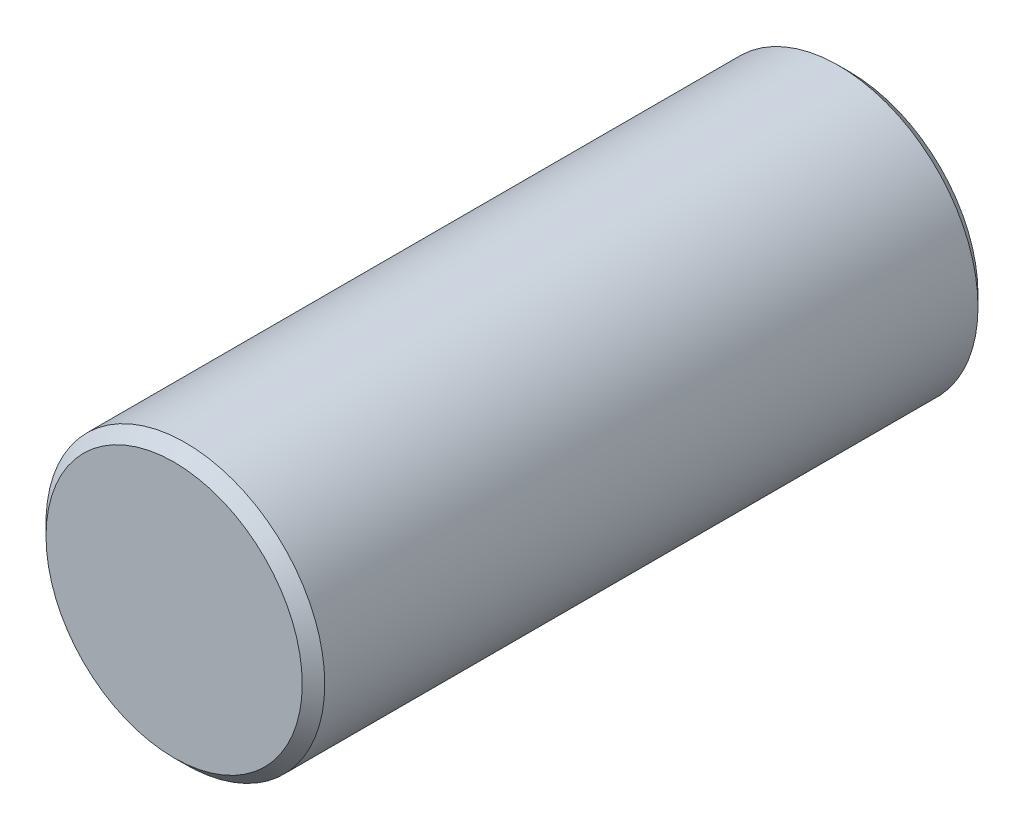
ISO-10303-21;
HEADER;
FILE_DESCRIPTION(('STEP AP214'),'2;1');
FILE_NAME('part.step','',(''),(''),'','','');
FILE_SCHEMA(('AUTOMOTIVE_DESIGN { 1 0 10303 214 1 1 1 1 }'));
ENDSEC;
DATA;
#1=APPLICATION_CONTEXT('core data for automotive mechanical design processes');
#2=APPLICATION_PROTOCOL_DEFINITION('international standard','automotive_design',2000,#1);
#3=PRODUCT_CONTEXT('',#1,'mechanical');
#4=PRODUCT('Part','Part','',(#3));
#5=PRODUCT_RELATED_PRODUCT_CATEGORY('part','',(#4));
#6=PRODUCT_DEFINITION_FORMATION('','',#4);
#7=PRODUCT_DEFINITION_CONTEXT('part definition',#1,'design');
#8=PRODUCT_DEFINITION('design','',#6,#7);
#9=PRODUCT_DEFINITION_SHAPE('','',#8);
#10=(LENGTH_UNIT() NAMED_UNIT(*) SI_UNIT(.MILLI.,.METRE.));
#11=(NAMED_UNIT(*) PLANE_ANGLE_UNIT() SI_UNIT($,.RADIAN.));
#12=(NAMED_UNIT(*) SI_UNIT($,.STERADIAN.) SOLID_ANGLE_UNIT());
#13=UNCERTAINTY_MEASURE_WITH_UNIT(LENGTH_MEASURE(1.E-05),#10,'distance_accuracy_value','');
#14=(GEOMETRIC_REPRESENTATION_CONTEXT(3) GLOBAL_UNCERTAINTY_ASSIGNED_CONTEXT((#13)) GLOBAL_UNIT_ASSIGNED_CONTEXT((#10,
#11,#12)) REPRESENTATION_CONTEXT('',''));
#15=CARTESIAN_POINT('',(0.,0.,0.));
#16=DIRECTION('',(0.,0.,1.));
#17=DIRECTION('',(1.,0.,0.));
#18=AXIS2_PLACEMENT_3D('',#15,#16,#17);
#19=CARTESIAN_POINT('',(0.,0.,12.));
#20=DIRECTION('',(0.,0.,-1.));
#21=DIRECTION('',(-1.,0.,0.));
#22=AXIS2_PLACEMENT_3D('',#19,#20,#21);
#23=CYLINDRICAL_SURFACE('',#22,2.475);
#24=CARTESIAN_POINT('',(0.,0.,0.200000000000002));
#25=DIRECTION('',(0.,0.,1.));
#26=DIRECTION('',(1.,0.,0.));
#27=AXIS2_PLACEMENT_3D('',#24,#25,#26);
#28=CIRCLE('',#27,2.475);
#29=CARTESIAN_POINT('',(2.475,0.,0.200000000000002));
#30=VERTEX_POINT('',#29);
#31=EDGE_CURVE('E42',#30,#30,#28,.T.);
#32=ORIENTED_EDGE('',*,*,#31,.T.);
#33=EDGE_LOOP('',(#32));
#34=FACE_BOUND('',#33,.T.);
#35=CARTESIAN_POINT('',(0.,0.,11.8));
#36=DIRECTION('',(0.,0.,1.));
#37=DIRECTION('',(1.,0.,0.));
#38=AXIS2_PLACEMENT_3D('',#35,#36,#37);
#39=CIRCLE('',#38,2.475);
#40=CARTESIAN_POINT('',(2.475,0.,11.8));
#41=VERTEX_POINT('',#40);
#42=EDGE_CURVE('E46',#41,#41,#39,.F.);
#43=ORIENTED_EDGE('',*,*,#42,.T.);
#44=EDGE_LOOP('',(#43));
#45=FACE_BOUND('',#44,.T.);
#46=ADVANCED_FACE('F31',(#34,#45),#23,.T.);
#47=CARTESIAN_POINT('',(0.,0.,12.));
#48=DIRECTION('',(0.,0.,1.));
#49=DIRECTION('',(1.,0.,0.));
#50=AXIS2_PLACEMENT_3D('',#47,#48,#49);
#51=PLANE('',#50);
#52=CARTESIAN_POINT('',(0.,0.,12.));
#53=DIRECTION('',(0.,0.,1.));
#54=DIRECTION('',(1.,0.,0.));
#55=AXIS2_PLACEMENT_3D('',#52,#53,#54);
#56=CIRCLE('',#55,2.275);
#57=CARTESIAN_POINT('',(2.275,0.,12.));
#58=VERTEX_POINT('',#57);
#59=EDGE_CURVE('E10',#58,#58,#56,.T.);
#60=ORIENTED_EDGE('',*,*,#59,.T.);
#61=EDGE_LOOP('',(#60));
#62=FACE_BOUND('',#61,.T.);
#63=ADVANCED_FACE('F62',(#62),#51,.T.);
#64=CARTESIAN_POINT('',(0.,0.,0.));
#65=DIRECTION('',(0.,0.,1.));
#66=DIRECTION('',(1.,0.,0.));
#67=AXIS2_PLACEMENT_3D('',#64,#65,#66);
#68=PLANE('',#67);
#69=CARTESIAN_POINT('',(0.,0.,0.));
#70=DIRECTION('',(0.,0.,1.));
#71=DIRECTION('',(1.,0.,0.));
#72=AXIS2_PLACEMENT_3D('',#69,#70,#71);
#73=CIRCLE('',#72,2.275);
#74=CARTESIAN_POINT('',(2.275,0.,0.));
#75=VERTEX_POINT('',#74);
#76=EDGE_CURVE('E38',#75,#75,#73,.F.);
#77=ORIENTED_EDGE('',*,*,#76,.T.);
#78=EDGE_LOOP('',(#77));
#79=FACE_BOUND('',#78,.T.);
#80=ADVANCED_FACE('F59',(#79),#68,.F.);
#81=CARTESIAN_POINT('',(0.,0.,0.200000000000002));
#82=DIRECTION('',(0.,0.,1.));
#83=DIRECTION('',(1.,0.,0.));
#84=AXIS2_PLACEMENT_3D('',#81,#82,#83);
#85=CONICAL_SURFACE('',#84,2.475,0.785398163397446);
#86=ORIENTED_EDGE('',*,*,#76,.F.);
#87=EDGE_LOOP('',(#86));
#88=FACE_BOUND('',#87,.T.);
#89=ORIENTED_EDGE('',*,*,#31,.F.);
#90=EDGE_LOOP('',(#89));
#91=FACE_BOUND('',#90,.T.);
#92=ADVANCED_FACE('F55',(#88,#91),#85,.T.);
#93=CARTESIAN_POINT('',(0.,0.,12.));
#94=DIRECTION('',(0.,0.,-1.));
#95=DIRECTION('',(-1.,0.,0.));
#96=AXIS2_PLACEMENT_3D('',#93,#94,#95);
#97=CONICAL_SURFACE('',#96,2.275,0.785398163397448);
#98=ORIENTED_EDGE('',*,*,#42,.F.);
#99=EDGE_LOOP('',(#98));
#100=FACE_BOUND('',#99,.T.);
#101=ORIENTED_EDGE('',*,*,#59,.F.);
#102=EDGE_LOOP('',(#101));
#103=FACE_BOUND('',#102,.T.);
#104=ADVANCED_FACE('F33',(#100,#103),#97,.T.);
#105=CLOSED_SHELL('',(#46,#63,#80,#92,#104));
#106=MANIFOLD_SOLID_BREP('B2',#105);
#107=ADVANCED_BREP_SHAPE_REPRESENTATION('',(#18,#106),#14);
#108=SHAPE_DEFINITION_REPRESENTATION(#9,#107);
ENDSEC;
END-ISO-10303-21;
